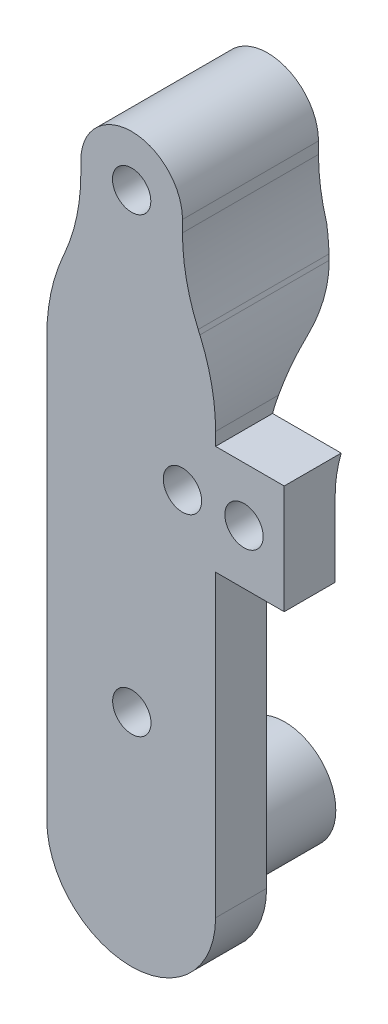
ISO-10303-21;
HEADER;
FILE_DESCRIPTION(('STEP AP214'),'2;1');
FILE_NAME('part.step','',(''),(''),'','','');
FILE_SCHEMA(('AUTOMOTIVE_DESIGN { 1 0 10303 214 1 1 1 1 }'));
ENDSEC;
DATA;
#1=APPLICATION_CONTEXT('core data for automotive mechanical design processes');
#2=APPLICATION_PROTOCOL_DEFINITION('international standard','automotive_design',2000,#1);
#3=PRODUCT_CONTEXT('',#1,'mechanical');
#4=PRODUCT('Part','Part','',(#3));
#5=PRODUCT_RELATED_PRODUCT_CATEGORY('part','',(#4));
#6=PRODUCT_DEFINITION_FORMATION('','',#4);
#7=PRODUCT_DEFINITION_CONTEXT('part definition',#1,'design');
#8=PRODUCT_DEFINITION('design','',#6,#7);
#9=PRODUCT_DEFINITION_SHAPE('','',#8);
#10=(LENGTH_UNIT() NAMED_UNIT(*) SI_UNIT(.MILLI.,.METRE.));
#11=(NAMED_UNIT(*) PLANE_ANGLE_UNIT() SI_UNIT($,.RADIAN.));
#12=(NAMED_UNIT(*) SI_UNIT($,.STERADIAN.) SOLID_ANGLE_UNIT());
#13=UNCERTAINTY_MEASURE_WITH_UNIT(LENGTH_MEASURE(1.E-05),#10,'distance_accuracy_value','');
#14=(GEOMETRIC_REPRESENTATION_CONTEXT(3) GLOBAL_UNCERTAINTY_ASSIGNED_CONTEXT((#13)) GLOBAL_UNIT_ASSIGNED_CONTEXT((#10,
#11,#12)) REPRESENTATION_CONTEXT('',''));
#15=CARTESIAN_POINT('',(0.,0.,0.));
#16=DIRECTION('',(0.,0.,1.));
#17=DIRECTION('',(1.,0.,0.));
#18=AXIS2_PLACEMENT_3D('',#15,#16,#17);
#19=CARTESIAN_POINT('',(3.60162761026961,0.,7.9375));
#20=DIRECTION('',(0.,0.,1.));
#21=DIRECTION('',(1.,0.,0.));
#22=AXIS2_PLACEMENT_3D('',#19,#20,#21);
#23=PLANE('',#22);
#24=DIRECTION('',(0.,1.,0.));
#25=VECTOR('',#24,1.);
#26=CARTESIAN_POINT('',(-18.5661840727653,0.,7.9375));
#27=LINE('',#26,#25);
#28=CARTESIAN_POINT('',(-18.5661840727653,-26.5932502254068,7.9375));
#29=VERTEX_POINT('',#28);
#30=CARTESIAN_POINT('',(-18.5661840727653,8.45332411273592,7.9375));
#31=VERTEX_POINT('',#30);
#32=EDGE_CURVE('E373',#29,#31,#27,.T.);
#33=ORIENTED_EDGE('',*,*,#32,.T.);
#34=DIRECTION('',(-1.,0.,0.));
#35=VECTOR('',#34,1.);
#36=CARTESIAN_POINT('',(3.60162761026961,8.45332411273592,7.9375));
#37=LINE('',#36,#35);
#38=CARTESIAN_POINT('',(3.60162761026961,8.45332411273592,7.9375));
#39=VERTEX_POINT('',#38);
#40=EDGE_CURVE('E262',#39,#31,#37,.T.);
#41=ORIENTED_EDGE('',*,*,#40,.F.);
#42=DIRECTION('',(0.,1.,0.));
#43=VECTOR('',#42,1.);
#44=CARTESIAN_POINT('',(3.60162761026961,0.,7.9375));
#45=LINE('',#44,#43);
#46=CARTESIAN_POINT('',(3.60162761026961,1.35944977459315,7.9375));
#47=VERTEX_POINT('',#46);
#48=EDGE_CURVE('E379',#47,#39,#45,.T.);
#49=ORIENTED_EDGE('',*,*,#48,.F.);
#50=DIRECTION('',(-1.,0.,0.));
#51=VECTOR('',#50,1.);
#52=CARTESIAN_POINT('',(0.,1.35944977459315,7.9375));
#53=LINE('',#52,#51);
#54=CARTESIAN_POINT('',(-2.80556070669548,1.35944977459315,7.9375));
#55=VERTEX_POINT('',#54);
#56=EDGE_CURVE('E663',#47,#55,#53,.T.);
#57=ORIENTED_EDGE('',*,*,#56,.T.);
#58=DIRECTION('',(0.,1.,0.));
#59=VECTOR('',#58,1.);
#60=CARTESIAN_POINT('',(-2.80556070669548,0.,7.9375));
#61=LINE('',#60,#59);
#62=CARTESIAN_POINT('',(-2.80556070669548,-26.5932502254068,7.9375));
#63=VERTEX_POINT('',#62);
#64=EDGE_CURVE('E668',#63,#55,#61,.T.);
#65=ORIENTED_EDGE('',*,*,#64,.F.);
#66=CARTESIAN_POINT('',(-10.6858723897304,-26.5932502254068,7.9375));
#67=DIRECTION('',(0.,0.,1.));
#68=DIRECTION('',(1.,0.,0.));
#69=AXIS2_PLACEMENT_3D('',#66,#67,#68);
#70=CIRCLE('',#69,7.88031168303493);
#71=EDGE_CURVE('E679',#29,#63,#70,.T.);
#72=ORIENTED_EDGE('',*,*,#71,.F.);
#73=EDGE_LOOP('',(#33,#41,#49,#57,#65,#72));
#74=FACE_BOUND('',#73,.T.);
#75=CARTESIAN_POINT('',(-10.6286840727653,-13.8686828818217,7.9375));
#76=DIRECTION('',(0.,0.,1.));
#77=DIRECTION('',(1.,0.,0.));
#78=AXIS2_PLACEMENT_3D('',#75,#76,#77);
#79=CIRCLE('',#78,1.7907);
#80=CARTESIAN_POINT('',(-8.83798407276534,-13.8686828818217,7.9375));
#81=VERTEX_POINT('',#80);
#82=EDGE_CURVE('E689',#81,#81,#79,.T.);
#83=ORIENTED_EDGE('',*,*,#82,.T.);
#84=EDGE_LOOP('',(#83));
#85=FACE_BOUND('',#84,.T.);
#86=CARTESIAN_POINT('',(-0.151184072765344,6.45131711817826,7.9375));
#87=DIRECTION('',(0.,0.,1.));
#88=DIRECTION('',(1.,0.,0.));
#89=AXIS2_PLACEMENT_3D('',#86,#87,#88);
#90=CIRCLE('',#89,1.7907);
#91=CARTESIAN_POINT('',(1.63951592723466,6.45131711817826,7.9375));
#92=VERTEX_POINT('',#91);
#93=EDGE_CURVE('E687',#92,#92,#90,.T.);
#94=ORIENTED_EDGE('',*,*,#93,.T.);
#95=EDGE_LOOP('',(#94));
#96=FACE_BOUND('',#95,.T.);
#97=CARTESIAN_POINT('',(-5.8979723897304,6.45131711817826,7.9375));
#98=DIRECTION('',(0.,0.,1.));
#99=DIRECTION('',(1.,0.,0.));
#100=AXIS2_PLACEMENT_3D('',#97,#98,#99);
#101=CIRCLE('',#100,1.7907);
#102=CARTESIAN_POINT('',(-4.1072723897304,6.45131711817826,7.9375));
#103=VERTEX_POINT('',#102);
#104=EDGE_CURVE('E684',#103,#103,#101,.T.);
#105=ORIENTED_EDGE('',*,*,#104,.T.);
#106=EDGE_LOOP('',(#105));
#107=FACE_BOUND('',#106,.T.);
#108=CARTESIAN_POINT('',(-10.6286840727653,-26.5686828818217,7.9375));
#109=DIRECTION('',(0.,0.,1.));
#110=DIRECTION('',(1.,0.,0.));
#111=AXIS2_PLACEMENT_3D('',#108,#109,#110);
#112=CIRCLE('',#111,4.7625);
#113=CARTESIAN_POINT('',(-5.86618407276534,-26.5686828818217,7.9375));
#114=VERTEX_POINT('',#113);
#115=EDGE_CURVE('E11',#114,#114,#112,.F.);
#116=ORIENTED_EDGE('',*,*,#115,.F.);
#117=EDGE_LOOP('',(#116));
#118=FACE_BOUND('',#117,.T.);
#119=ADVANCED_FACE('F35',(#74,#85,#96,#107,#118),#23,.F.);
#120=CARTESIAN_POINT('',(-20.5855607066955,12.7380281849792,12.7));
#121=DIRECTION('',(0.,0.,-1.));
#122=DIRECTION('',(-1.,0.,0.));
#123=AXIS2_PLACEMENT_3D('',#120,#121,#122);
#124=CYLINDRICAL_SURFACE('',#123,17.78);
#125=CARTESIAN_POINT('',(-4.27280925948273,19.8106896516026,0.622732267532294));
#126=CARTESIAN_POINT('',(-4.22896199061409,19.7095613246999,0.665736288642379));
#127=CARTESIAN_POINT('',(-4.18638890693539,19.6087878170611,0.710838318348563));
#128=CARTESIAN_POINT('',(-4.10377407843014,19.4081759395716,0.805251126791299));
#129=CARTESIAN_POINT('',(-4.06373239764373,19.3083375934334,0.854562011930563));
#130=CARTESIAN_POINT('',(-3.94738066271942,19.0105674357862,1.00882558695881));
#131=CARTESIAN_POINT('',(-3.87484558534822,18.8143843753311,1.12010755892589));
#132=CARTESIAN_POINT('',(-3.74122459889184,18.4333396128202,1.35641056152912));
#133=CARTESIAN_POINT('',(-3.67991088730036,18.2483205172011,1.48105008309362));
#134=CARTESIAN_POINT('',(-3.56628540859261,17.8866783797788,1.74549461429801));
#135=CARTESIAN_POINT('',(-3.51397044655756,17.7100523742767,1.88529421263822));
#136=CARTESIAN_POINT('',(-3.40135283330873,17.3084114181016,2.22943870080631));
#137=CARTESIAN_POINT('',(-3.34437991138073,17.0873568215305,2.43957044129633));
#138=CARTESIAN_POINT('',(-3.26853327587871,16.7705279173371,2.77411382781132));
#139=CARTESIAN_POINT('',(-3.24470269788698,16.6666089036127,2.88985564601395));
#140=CARTESIAN_POINT('',(-3.20021239885874,16.4647851367965,3.127077549516));
#141=CARTESIAN_POINT('',(-3.17955307362549,16.3668811353499,3.24855834862575));
#142=CARTESIAN_POINT('',(-3.16034199645584,16.2721692263519,3.37274488847736));
#143=B_SPLINE_CURVE_WITH_KNOTS('',3,(#125,#126,#127,#128,#129,#130,#131,#132,#133,#134,#135,
#136,#137,#138,#139,#140,#141,#142),.UNSPECIFIED.,.F.,.F.,(4,2,2,2,2,2,2,2,4),(0.,
0.35489761851844,0.709804211747671,1.41963091952058,2.11288210095623,2.80588663996147,
3.73446081441781,4.20633928794254,4.67827660869848),.UNSPECIFIED.);
#144=CARTESIAN_POINT('',(-4.27280925948273,19.8106896516026,0.622732267532297));
#145=VERTEX_POINT('',#144);
#146=CARTESIAN_POINT('',(-3.16034199645584,16.2721692263519,3.37274488847736));
#147=VERTEX_POINT('',#146);
#148=EDGE_CURVE('E252',#145,#147,#143,.T.);
#149=ORIENTED_EDGE('',*,*,#148,.F.);
#150=DIRECTION('',(0.,0.,-1.));
#151=VECTOR('',#150,1.);
#152=CARTESIAN_POINT('',(-4.27280925948273,19.8106896516026,12.7));
#153=LINE('',#152,#151);
#154=CARTESIAN_POINT('',(-4.27280925948273,19.8106896516026,12.7));
#155=VERTEX_POINT('',#154);
#156=EDGE_CURVE('E208',#155,#145,#153,.T.);
#157=ORIENTED_EDGE('',*,*,#156,.F.);
#158=CARTESIAN_POINT('',(-20.5855607066955,12.7380281849792,12.7));
#159=DIRECTION('',(0.,0.,1.));
#160=DIRECTION('',(1.,0.,0.));
#161=AXIS2_PLACEMENT_3D('',#158,#159,#160);
#162=CIRCLE('',#161,17.78);
#163=CARTESIAN_POINT('',(-2.80556070669547,12.7380281849792,12.7));
#164=VERTEX_POINT('',#163);
#165=EDGE_CURVE('E624',#164,#155,#162,.T.);
#166=ORIENTED_EDGE('',*,*,#165,.F.);
#167=DIRECTION('',(0.,0.,-1.));
#168=VECTOR('',#167,1.);
#169=CARTESIAN_POINT('',(-2.80556070669547,12.7380281849792,12.7));
#170=LINE('',#169,#168);
#171=CARTESIAN_POINT('',(-2.80556070669547,12.7380281849792,6.81854866633524));
#172=VERTEX_POINT('',#171);
#173=EDGE_CURVE('E211',#164,#172,#170,.T.);
#174=ORIENTED_EDGE('',*,*,#173,.T.);
#175=CARTESIAN_POINT('',(-2.80556070669547,12.7380281849792,6.81854866633524));
#176=CARTESIAN_POINT('',(-2.80553996273045,12.9499645172494,6.69979018167025));
#177=CARTESIAN_POINT('',(-2.80934955256784,13.1568967579065,6.57218157788998));
#178=CARTESIAN_POINT('',(-2.82340534440474,13.5593633567003,6.30032318239146));
#179=CARTESIAN_POINT('',(-2.83365285745637,13.7548953843729,6.15607000597178));
#180=CARTESIAN_POINT('',(-2.8591415350942,14.1298784304107,5.85460813032012));
#181=CARTESIAN_POINT('',(-2.87429509162777,14.3095458831307,5.69766054341327));
#182=CARTESIAN_POINT('',(-2.90837551794025,14.6552279798961,5.3699196508939));
#183=CARTESIAN_POINT('',(-2.92730025158917,14.8212502781906,5.19913421588552));
#184=CARTESIAN_POINT('',(-2.95724302957186,15.0568272640496,4.93620124418279));
#185=CARTESIAN_POINT('',(-2.9673071850757,15.1319875390125,4.84890651205389));
#186=CARTESIAN_POINT('',(-2.98792087721756,15.2790921888179,4.67108296937014));
#187=CARTESIAN_POINT('',(-2.99847226723567,15.3510218047874,4.58054216354444));
#188=CARTESIAN_POINT('',(-3.00917448930018,15.4211322710998,4.48861502211213));
#189=B_SPLINE_CURVE_WITH_KNOTS('',3,(#175,#176,#177,#178,#179,#180,#181,#182,#183,#184,#185,
#186,#187,#188),.UNSPECIFIED.,.F.,.F.,(4,2,2,2,2,2,4),(0.,0.728531239658855,1.45721088931712,
2.17353648255022,2.88945747076875,3.23627654611799,3.58454561209276),.UNSPECIFIED.);
#190=CARTESIAN_POINT('',(-3.00917448930018,15.4211322710998,4.48861502211213));
#191=VERTEX_POINT('',#190);
#192=EDGE_CURVE('E319',#172,#191,#189,.T.);
#193=ORIENTED_EDGE('',*,*,#192,.T.);
#194=CARTESIAN_POINT('',(-20.5855607066955,12.7380281849792,8.00667107908841));
#195=DIRECTION('',(0.,0.795139582148108,0.60642645465162));
#196=DIRECTION('',(0.,0.60642645465162,-0.795139582148108));
#197=AXIS2_PLACEMENT_3D('',#194,#195,#196);
#198=ELLIPSE('',#197,29.3193013985748,17.78);
#199=EDGE_CURVE('E181',#191,#147,#198,.T.);
#200=ORIENTED_EDGE('',*,*,#199,.T.);
#201=EDGE_LOOP('',(#149,#157,#166,#174,#193,#200));
#202=FACE_BOUND('',#201,.T.);
#203=ADVANCED_FACE('F305',(#202),#124,.T.);
#204=CARTESIAN_POINT('',(3.63342929666762,1.57533298177198,12.7));
#205=DIRECTION('',(-0.917477584207683,-0.397787484062073,0.));
#206=DIRECTION('',(0.397787484062073,-0.917477584207683,0.));
#207=AXIS2_PLACEMENT_3D('',#204,#205,#206);
#208=PLANE('',#207);
#209=CARTESIAN_POINT('',(-5.75963331160175,23.2399773847158,8.68685991058949));
#210=DIRECTION('',(-0.917477584207683,-0.397787484062073,0.));
#211=DIRECTION('',(-0.397787484062073,0.917477584207683,0.));
#212=AXIS2_PLACEMENT_3D('',#209,#210,#211);
#213=ELLIPSE('',#212,9.55118702716597,8.76299999999999);
#214=CARTESIAN_POINT('',(-4.43072383694313,20.1749119834871,0.477381054645554));
#215=VERTEX_POINT('',#214);
#216=EDGE_CURVE('E292',#215,#145,#213,.T.);
#217=ORIENTED_EDGE('',*,*,#216,.F.);
#218=DIRECTION('',(0.,0.,-1.));
#219=VECTOR('',#218,1.);
#220=CARTESIAN_POINT('',(-4.43072383694314,20.1749119834871,12.7));
#221=LINE('',#220,#219);
#222=CARTESIAN_POINT('',(-4.43072383694314,20.1749119834871,12.7));
#223=VERTEX_POINT('',#222);
#224=EDGE_CURVE('E205',#223,#215,#221,.T.);
#225=ORIENTED_EDGE('',*,*,#224,.F.);
#226=DIRECTION('',(-0.397787484062073,0.917477584207683,0.));
#227=VECTOR('',#226,1.);
#228=CARTESIAN_POINT('',(3.63342929666762,1.57533298177198,12.7));
#229=LINE('',#228,#227);
#230=EDGE_CURVE('E622',#155,#223,#229,.T.);
#231=ORIENTED_EDGE('',*,*,#230,.F.);
#232=ORIENTED_EDGE('',*,*,#156,.T.);
#233=EDGE_LOOP('',(#217,#225,#231,#232));
#234=FACE_BOUND('',#233,.T.);
#235=ADVANCED_FACE('F299',(#234),#208,.F.);
#236=CARTESIAN_POINT('',(11.8820276102696,27.2475734501104,12.7));
#237=DIRECTION('',(0.,0.,-1.));
#238=DIRECTION('',(-1.,0.,0.));
#239=AXIS2_PLACEMENT_3D('',#236,#237,#238);
#240=CYLINDRICAL_SURFACE('',#239,17.78);
#241=ORIENTED_EDGE('',*,*,#224,.T.);
#242=CARTESIAN_POINT('',(-4.43072383694313,20.1749119834871,0.477381054645554));
#243=CARTESIAN_POINT('',(-4.49659893518475,20.3268330196942,0.420657521074083));
#244=CARTESIAN_POINT('',(-4.56088989065264,20.4809492455378,0.367925294425049));
#245=CARTESIAN_POINT('',(-4.68572899031803,20.7926623395471,0.270960585733989));
#246=CARTESIAN_POINT('',(-4.74628898176269,20.9502457766355,0.226700146714175));
#247=CARTESIAN_POINT('',(-4.86354172418653,21.269016708808,0.146808579875556));
#248=CARTESIAN_POINT('',(-4.92023429818063,21.430204368385,0.111177846788976));
#249=CARTESIAN_POINT('',(-5.02961038897305,21.7562488008639,0.0487822539979684));
#250=CARTESIAN_POINT('',(-5.08227974923076,21.9211161093595,0.0220476814330709));
#251=CARTESIAN_POINT('',(-5.13267538044139,22.0873135595729,0.));
#252=B_SPLINE_CURVE_WITH_KNOTS('',3,(#242,#243,#244,#245,#246,#247,#248,#249,#250,#251),
.UNSPECIFIED.,.F.,.F.,(4,2,2,2,4),(0.,0.525060076447199,1.04835639184211,1.57167663886644,
2.09676073325123),.UNSPECIFIED.);
#253=CARTESIAN_POINT('',(-5.13267538044139,22.0873135595729,0.));
#254=VERTEX_POINT('',#253);
#255=EDGE_CURVE('E285',#215,#254,#252,.T.);
#256=ORIENTED_EDGE('',*,*,#255,.T.);
#257=CARTESIAN_POINT('',(11.8820276102696,27.2475734501104,0.));
#258=DIRECTION('',(0.,0.,1.));
#259=DIRECTION('',(1.,0.,0.));
#260=AXIS2_PLACEMENT_3D('',#257,#258,#259);
#261=CIRCLE('',#260,17.78);
#262=CARTESIAN_POINT('',(-5.89797238973039,27.2475734501104,0.));
#263=VERTEX_POINT('',#262);
#264=EDGE_CURVE('E177',#263,#254,#261,.T.);
#265=ORIENTED_EDGE('',*,*,#264,.F.);
#266=DIRECTION('',(0.,0.,-1.));
#267=VECTOR('',#266,1.);
#268=CARTESIAN_POINT('',(-5.89797238973039,27.2475734501104,12.7));
#269=LINE('',#268,#267);
#270=CARTESIAN_POINT('',(-5.89797238973039,27.2475734501104,12.7));
#271=VERTEX_POINT('',#270);
#272=EDGE_CURVE('E203',#271,#263,#269,.T.);
#273=ORIENTED_EDGE('',*,*,#272,.F.);
#274=CARTESIAN_POINT('',(11.8820276102696,27.2475734501104,12.7));
#275=DIRECTION('',(0.,0.,1.));
#276=DIRECTION('',(1.,0.,0.));
#277=AXIS2_PLACEMENT_3D('',#274,#275,#276);
#278=CIRCLE('',#277,17.78);
#279=EDGE_CURVE('E619',#271,#223,#278,.T.);
#280=ORIENTED_EDGE('',*,*,#279,.T.);
#281=EDGE_LOOP('',(#241,#256,#265,#273,#280));
#282=FACE_BOUND('',#281,.T.);
#283=ADVANCED_FACE('F293',(#282),#240,.F.);
#284=CARTESIAN_POINT('',(-33.1711840727653,27.2867056998739,12.7));
#285=DIRECTION('',(0.,0.,-1.));
#286=DIRECTION('',(-1.,0.,0.));
#287=AXIS2_PLACEMENT_3D('',#284,#285,#286);
#288=CYLINDRICAL_SURFACE('',#287,17.78);
#289=CARTESIAN_POINT('',(-16.8792929836201,20.1661239301425,0.480667496332566));
#290=CARTESIAN_POINT('',(-16.8126098192679,20.318678174608,0.423521380595959));
#291=CARTESIAN_POINT('',(-16.7475219688787,20.473455619094,0.37039934873752));
#292=CARTESIAN_POINT('',(-16.6211218748251,20.786537496415,0.272729427097992));
#293=CARTESIAN_POINT('',(-16.5597975956829,20.9448282157668,0.228153120460066));
#294=CARTESIAN_POINT('',(-16.4410504139583,21.2650628508689,0.147707071534118));
#295=CARTESIAN_POINT('',(-16.3836276931759,21.4270069363864,0.111837734762239));
#296=CARTESIAN_POINT('',(-16.2728275187645,21.7546148435826,0.0490474562736576));
#297=CARTESIAN_POINT('',(-16.219464468493,21.920289431813,0.0221573239951851));
#298=CARTESIAN_POINT('',(-16.1683983783158,22.0873135595729,0.));
#299=B_SPLINE_CURVE_WITH_KNOTS('',3,(#289,#290,#291,#292,#293,#294,#295,#296,#297,#298),
.UNSPECIFIED.,.F.,.F.,(4,2,2,2,4),(0.,0.528033887393433,1.05428024701051,1.58055111118782,
2.1086095928006),.UNSPECIFIED.);
#300=CARTESIAN_POINT('',(-16.8792929836201,20.1661239301425,0.480667496332569));
#301=VERTEX_POINT('',#300);
#302=CARTESIAN_POINT('',(-16.1683983783158,22.0873135595729,0.));
#303=VERTEX_POINT('',#302);
#304=EDGE_CURVE('E50',#301,#303,#299,.T.);
#305=ORIENTED_EDGE('',*,*,#304,.F.);
#306=DIRECTION('',(0.,0.,-1.));
#307=VECTOR('',#306,1.);
#308=CARTESIAN_POINT('',(-16.8792929836201,20.1661239301425,12.7));
#309=LINE('',#308,#307);
#310=CARTESIAN_POINT('',(-16.8792929836201,20.1661239301425,12.7));
#311=VERTEX_POINT('',#310);
#312=EDGE_CURVE('E154',#311,#301,#309,.T.);
#313=ORIENTED_EDGE('',*,*,#312,.F.);
#314=CARTESIAN_POINT('',(-33.1711840727653,27.2867056998739,12.7));
#315=DIRECTION('',(0.,0.,1.));
#316=DIRECTION('',(1.,0.,0.));
#317=AXIS2_PLACEMENT_3D('',#314,#315,#316);
#318=CIRCLE('',#317,17.78);
#319=CARTESIAN_POINT('',(-15.3911840727653,27.2867056998739,12.7));
#320=VERTEX_POINT('',#319);
#321=EDGE_CURVE('E141',#320,#311,#318,.F.);
#322=ORIENTED_EDGE('',*,*,#321,.F.);
#323=DIRECTION('',(0.,0.,-1.));
#324=VECTOR('',#323,1.);
#325=CARTESIAN_POINT('',(-15.3911840727653,27.2867056998739,12.7));
#326=LINE('',#325,#324);
#327=CARTESIAN_POINT('',(-15.3911840727653,27.2867056998739,0.));
#328=VERTEX_POINT('',#327);
#329=EDGE_CURVE('E197',#320,#328,#326,.T.);
#330=ORIENTED_EDGE('',*,*,#329,.T.);
#331=CARTESIAN_POINT('',(-33.1711840727653,27.2867056998739,0.));
#332=DIRECTION('',(0.,0.,1.));
#333=DIRECTION('',(1.,0.,0.));
#334=AXIS2_PLACEMENT_3D('',#331,#332,#333);
#335=CIRCLE('',#334,17.78);
#336=EDGE_CURVE('E187',#328,#303,#335,.F.);
#337=ORIENTED_EDGE('',*,*,#336,.T.);
#338=EDGE_LOOP('',(#305,#313,#322,#330,#337));
#339=FACE_BOUND('',#338,.T.);
#340=ADVANCED_FACE('F298',(#339),#288,.F.);
#341=CARTESIAN_POINT('',(-21.572326083604,9.42846419737935,12.7));
#342=DIRECTION('',(0.916304335722455,-0.400482664214358,0.));
#343=DIRECTION('',(0.400482664214359,0.916304335722455,0.));
#344=AXIS2_PLACEMENT_3D('',#341,#342,#343);
#345=PLANE('',#344);
#346=CARTESIAN_POINT('',(-15.5358255646633,23.2399773847158,8.68685991058949));
#347=DIRECTION('',(0.916304335722455,-0.400482664214358,0.));
#348=DIRECTION('',(-0.400482664214359,-0.916304335722455,0.));
#349=AXIS2_PLACEMENT_3D('',#346,#347,#348);
#350=ELLIPSE('',#349,9.56341649643168,8.76299999999999);
#351=CARTESIAN_POINT('',(-17.0780751619105,19.711310306214,0.66572048722215));
#352=VERTEX_POINT('',#351);
#353=EDGE_CURVE('E151',#352,#301,#350,.T.);
#354=ORIENTED_EDGE('',*,*,#353,.F.);
#355=DIRECTION('',(0.,0.,-1.));
#356=VECTOR('',#355,1.);
#357=CARTESIAN_POINT('',(-17.0780751619105,19.711310306214,12.7));
#358=LINE('',#357,#356);
#359=CARTESIAN_POINT('',(-17.0780751619105,19.711310306214,12.7));
#360=VERTEX_POINT('',#359);
#361=EDGE_CURVE('E148',#360,#352,#358,.T.);
#362=ORIENTED_EDGE('',*,*,#361,.F.);
#363=DIRECTION('',(-0.400482664214359,-0.916304335722455,0.));
#364=VECTOR('',#363,1.);
#365=CARTESIAN_POINT('',(-21.572326083604,9.42846419737935,12.7));
#366=LINE('',#365,#364);
#367=EDGE_CURVE('E133',#311,#360,#366,.T.);
#368=ORIENTED_EDGE('',*,*,#367,.F.);
#369=ORIENTED_EDGE('',*,*,#312,.T.);
#370=EDGE_LOOP('',(#354,#362,#368,#369));
#371=FACE_BOUND('',#370,.T.);
#372=ADVANCED_FACE('F149',(#371),#345,.F.);
#373=CARTESIAN_POINT('',(-0.786184072765341,12.5907285364826,12.7));
#374=DIRECTION('',(0.,0.,-1.));
#375=DIRECTION('',(-1.,0.,0.));
#376=AXIS2_PLACEMENT_3D('',#373,#374,#375);
#377=CYLINDRICAL_SURFACE('',#376,17.78);
#378=ORIENTED_EDGE('',*,*,#361,.T.);
#379=CARTESIAN_POINT('',(-17.0780751619105,19.711310306214,0.66572048722215));
#380=CARTESIAN_POINT('',(-17.1220077633292,19.6107956023752,0.709938174263891));
#381=CARTESIAN_POINT('',(-17.1646642042854,19.5106588975349,0.756246884892099));
#382=CARTESIAN_POINT('',(-17.2474435908244,19.3113663361745,0.853057589493892));
#383=CARTESIAN_POINT('',(-17.2875664610798,19.2122105088915,0.903559708041728));
#384=CARTESIAN_POINT('',(-17.4041625144159,18.9165520544327,1.06137345157627));
#385=CARTESIAN_POINT('',(-17.4768593437691,18.7218671866478,1.17498864219536));
#386=CARTESIAN_POINT('',(-17.6108397208608,18.3438741744831,1.4158597627734));
#387=CARTESIAN_POINT('',(-17.6723458174506,18.1604078097985,1.54274535075208));
#388=CARTESIAN_POINT('',(-17.7863661505249,17.8020187183963,1.81162085744036));
#389=CARTESIAN_POINT('',(-17.838883835513,17.627092733561,1.95360494939145));
#390=CARTESIAN_POINT('',(-17.9177353373873,17.3500155523374,2.19694993640473));
#391=CARTESIAN_POINT('',(-17.94659105927,17.2447796070273,2.29402390195868));
#392=CARTESIAN_POINT('',(-18.0011412746067,17.0387616733312,2.49366501180116));
#393=CARTESIAN_POINT('',(-18.0268354704854,16.9379801047799,2.59623267187577));
#394=CARTESIAN_POINT('',(-18.0756039227785,16.7398162946364,2.80813372359635));
#395=CARTESIAN_POINT('',(-18.098633992373,16.6425060300344,2.91754454242139));
#396=CARTESIAN_POINT('',(-18.1418413929826,16.4532381500859,3.1414246011709));
#397=CARTESIAN_POINT('',(-18.162018980546,16.3612800538108,3.25589338497179));
#398=CARTESIAN_POINT('',(-18.1808785066143,16.2721692263519,3.37274488847736));
#399=B_SPLINE_CURVE_WITH_KNOTS('',3,(#379,#380,#381,#382,#383,#384,#385,#386,#387,#388,#389,
#390,#391,#392,#393,#394,#395,#396,#397,#398),.UNSPECIFIED.,.F.,.F.,(4,2,2,2,2,2,2,2,2,4),(0.,
0.35476477228259,0.70954008739308,1.41912139794631,2.11251402352546,2.80564002209987,
3.24360656759691,3.68161430475022,4.1260765116121,4.57049871867508),.UNSPECIFIED.);
#400=CARTESIAN_POINT('',(-18.1808785066143,16.2721692263519,3.37274488847736));
#401=VERTEX_POINT('',#400);
#402=EDGE_CURVE('E249',#352,#401,#399,.T.);
#403=ORIENTED_EDGE('',*,*,#402,.T.);
#404=CARTESIAN_POINT('',(-0.786184072765341,12.5907285364826,8.19980873008919));
#405=DIRECTION('',(0.,0.795139582148108,0.60642645465162));
#406=DIRECTION('',(0.,0.60642645465162,-0.795139582148108));
#407=AXIS2_PLACEMENT_3D('',#404,#405,#406);
#408=ELLIPSE('',#407,29.3193013985748,17.78);
#409=CARTESIAN_POINT('',(-18.3394519935562,15.4211322710998,4.48861502211213));
#410=VERTEX_POINT('',#409);
#411=EDGE_CURVE('E43',#410,#401,#408,.F.);
#412=ORIENTED_EDGE('',*,*,#411,.F.);
#413=CARTESIAN_POINT('',(-18.5661840727653,12.5907285364826,6.89926884018944));
#414=CARTESIAN_POINT('',(-18.5662063398615,12.8049762035687,6.78455510705702));
#415=CARTESIAN_POINT('',(-18.5623121929099,13.0143853435876,6.6608908401121));
#416=CARTESIAN_POINT('',(-18.5479021318596,13.4220972042836,6.39670983245155));
#417=CARTESIAN_POINT('',(-18.5373853184071,13.6203984125272,6.25619080496862));
#418=CARTESIAN_POINT('',(-18.5111763857094,14.0009971067857,5.96201547968641));
#419=CARTESIAN_POINT('',(-18.4955794669117,14.1835162224902,5.80863672341326));
#420=CARTESIAN_POINT('',(-18.4604228237586,14.5351763135483,5.48780646993579));
#421=CARTESIAN_POINT('',(-18.4408651227239,14.7043240584218,5.32036218340422));
#422=CARTESIAN_POINT('',(-18.4073741554779,14.9638595774293,5.04166388445938));
#423=CARTESIAN_POINT('',(-18.3942954995074,15.0588275670212,4.93453213368267));
#424=CARTESIAN_POINT('',(-18.3673682085765,15.2438674436237,4.71520267173173));
#425=CARTESIAN_POINT('',(-18.3535157655441,15.3339098246206,4.60298053218942));
#426=CARTESIAN_POINT('',(-18.3394519935562,15.4211322710998,4.48861502211213));
#427=B_SPLINE_CURVE_WITH_KNOTS('',3,(#413,#414,#415,#416,#417,#418,#419,#420,#421,#422,#423,
#424,#425,#426),.UNSPECIFIED.,.F.,.F.,(4,2,2,2,2,2,4),(0.,0.728778302871286,1.4576555947191,
2.17359198911399,2.88916357388404,3.3202893908802,3.75376495027548),.UNSPECIFIED.);
#428=CARTESIAN_POINT('',(-18.5661840727653,12.5907285364826,6.89926884018945));
#429=VERTEX_POINT('',#428);
#430=EDGE_CURVE('E327',#429,#410,#427,.T.);
#431=ORIENTED_EDGE('',*,*,#430,.F.);
#432=DIRECTION('',(0.,0.,-1.));
#433=VECTOR('',#432,1.);
#434=CARTESIAN_POINT('',(-18.5661840727653,12.5907285364826,12.7));
#435=LINE('',#434,#433);
#436=CARTESIAN_POINT('',(-18.5661840727653,12.5907285364826,12.7));
#437=VERTEX_POINT('',#436);
#438=EDGE_CURVE('E155',#437,#429,#435,.T.);
#439=ORIENTED_EDGE('',*,*,#438,.F.);
#440=CARTESIAN_POINT('',(-0.786184072765341,12.5907285364826,12.7));
#441=DIRECTION('',(0.,0.,1.));
#442=DIRECTION('',(1.,0.,0.));
#443=AXIS2_PLACEMENT_3D('',#440,#441,#442);
#444=CIRCLE('',#443,17.78);
#445=EDGE_CURVE('E139',#437,#360,#444,.F.);
#446=ORIENTED_EDGE('',*,*,#445,.T.);
#447=EDGE_LOOP('',(#378,#403,#412,#431,#439,#446));
#448=FACE_BOUND('',#447,.T.);
#449=ADVANCED_FACE('F157',(#448),#377,.T.);
#450=CARTESIAN_POINT('',(0.,0.,0.));
#451=DIRECTION('',(0.,0.,1.));
#452=DIRECTION('',(1.,0.,0.));
#453=AXIS2_PLACEMENT_3D('',#450,#451,#452);
#454=PLANE('',#453);
#455=CARTESIAN_POINT('',(-10.6445782312479,28.3342497745932,0.));
#456=DIRECTION('',(0.,0.,1.));
#457=DIRECTION('',(1.,0.,0.));
#458=AXIS2_PLACEMENT_3D('',#455,#456,#457);
#459=CIRCLE('',#458,1.7907);
#460=CARTESIAN_POINT('',(-8.85387823124787,28.3342497745932,0.));
#461=VERTEX_POINT('',#460);
#462=EDGE_CURVE('E190',#461,#461,#459,.T.);
#463=ORIENTED_EDGE('',*,*,#462,.T.);
#464=EDGE_LOOP('',(#463));
#465=FACE_BOUND('',#464,.T.);
#466=DIRECTION('',(-1.,0.,0.));
#467=VECTOR('',#466,1.);
#468=CARTESIAN_POINT('',(3.60162761026961,22.0873135595729,0.));
#469=LINE('',#468,#467);
#470=EDGE_CURVE('E228',#303,#254,#469,.F.);
#471=ORIENTED_EDGE('',*,*,#470,.F.);
#472=ORIENTED_EDGE('',*,*,#336,.F.);
#473=DIRECTION('',(0.,-1.,0.));
#474=VECTOR('',#473,1.);
#475=CARTESIAN_POINT('',(-15.3911840727653,0.,0.));
#476=LINE('',#475,#474);
#477=CARTESIAN_POINT('',(-15.3911840727653,28.3342497745932,0.));
#478=VERTEX_POINT('',#477);
#479=EDGE_CURVE('E82',#478,#328,#476,.T.);
#480=ORIENTED_EDGE('',*,*,#479,.F.);
#481=CARTESIAN_POINT('',(-10.6445782312479,28.3342497745932,0.));
#482=DIRECTION('',(0.,0.,1.));
#483=DIRECTION('',(1.,0.,0.));
#484=AXIS2_PLACEMENT_3D('',#481,#482,#483);
#485=CIRCLE('',#484,4.74660584151747);
#486=CARTESIAN_POINT('',(-5.8979723897304,28.3342497745932,0.));
#487=VERTEX_POINT('',#486);
#488=EDGE_CURVE('E184',#487,#478,#485,.T.);
#489=ORIENTED_EDGE('',*,*,#488,.F.);
#490=DIRECTION('',(0.,-1.,0.));
#491=VECTOR('',#490,1.);
#492=CARTESIAN_POINT('',(-5.89797238973035,0.,0.));
#493=LINE('',#492,#491);
#494=EDGE_CURVE('E180',#487,#263,#493,.T.);
#495=ORIENTED_EDGE('',*,*,#494,.T.);
#496=ORIENTED_EDGE('',*,*,#264,.T.);
#497=EDGE_LOOP('',(#471,#472,#480,#489,#495,#496));
#498=FACE_BOUND('',#497,.T.);
#499=ADVANCED_FACE('F344',(#465,#498),#454,.F.);
#500=CARTESIAN_POINT('',(-10.6858723897304,-26.5932502254068,12.7));
#501=DIRECTION('',(0.,0.,-1.));
#502=DIRECTION('',(-1.,0.,0.));
#503=AXIS2_PLACEMENT_3D('',#500,#501,#502);
#504=CYLINDRICAL_SURFACE('',#503,7.88031168303493);
#505=DIRECTION('',(0.,0.,-1.));
#506=VECTOR('',#505,1.);
#507=CARTESIAN_POINT('',(-18.5661840727653,-26.5932502254068,12.7));
#508=LINE('',#507,#506);
#509=CARTESIAN_POINT('',(-18.5661840727653,-26.5932502254068,12.7));
#510=VERTEX_POINT('',#509);
#511=EDGE_CURVE('E59',#510,#29,#508,.T.);
#512=ORIENTED_EDGE('',*,*,#511,.T.);
#513=ORIENTED_EDGE('',*,*,#71,.T.);
#514=DIRECTION('',(0.,0.,-1.));
#515=VECTOR('',#514,1.);
#516=CARTESIAN_POINT('',(-2.80556070669548,-26.5932502254068,12.7));
#517=LINE('',#516,#515);
#518=CARTESIAN_POINT('',(-2.80556070669548,-26.5932502254068,12.7));
#519=VERTEX_POINT('',#518);
#520=EDGE_CURVE('E226',#519,#63,#517,.T.);
#521=ORIENTED_EDGE('',*,*,#520,.F.);
#522=CARTESIAN_POINT('',(-10.6858723897304,-26.5932502254068,12.7));
#523=DIRECTION('',(0.,0.,1.));
#524=DIRECTION('',(1.,0.,0.));
#525=AXIS2_PLACEMENT_3D('',#522,#523,#524);
#526=CIRCLE('',#525,7.88031168303493);
#527=EDGE_CURVE('E193',#510,#519,#526,.T.);
#528=ORIENTED_EDGE('',*,*,#527,.F.);
#529=EDGE_LOOP('',(#512,#513,#521,#528));
#530=FACE_BOUND('',#529,.T.);
#531=ADVANCED_FACE('F37',(#530),#504,.T.);
#532=CARTESIAN_POINT('',(-2.80556070669548,0.,12.7));
#533=DIRECTION('',(-1.,0.,0.));
#534=DIRECTION('',(0.,-1.,0.));
#535=AXIS2_PLACEMENT_3D('',#532,#533,#534);
#536=PLANE('',#535);
#537=ORIENTED_EDGE('',*,*,#520,.T.);
#538=ORIENTED_EDGE('',*,*,#64,.T.);
#539=DIRECTION('',(0.,0.,-1.));
#540=VECTOR('',#539,1.);
#541=CARTESIAN_POINT('',(-2.80556070669548,1.35944977459315,12.7));
#542=LINE('',#541,#540);
#543=CARTESIAN_POINT('',(-2.80556070669548,1.35944977459315,12.7));
#544=VERTEX_POINT('',#543);
#545=EDGE_CURVE('E223',#544,#55,#542,.T.);
#546=ORIENTED_EDGE('',*,*,#545,.F.);
#547=DIRECTION('',(0.,1.,0.));
#548=VECTOR('',#547,1.);
#549=CARTESIAN_POINT('',(-2.80556070669548,0.,12.7));
#550=LINE('',#549,#548);
#551=EDGE_CURVE('E91',#519,#544,#550,.T.);
#552=ORIENTED_EDGE('',*,*,#551,.F.);
#553=EDGE_LOOP('',(#537,#538,#546,#552));
#554=FACE_BOUND('',#553,.T.);
#555=ADVANCED_FACE('F502',(#554),#536,.F.);
#556=CARTESIAN_POINT('',(0.,1.35944977459315,12.7));
#557=DIRECTION('',(0.,-1.,0.));
#558=DIRECTION('',(1.,0.,0.));
#559=AXIS2_PLACEMENT_3D('',#556,#557,#558);
#560=PLANE('',#559);
#561=ORIENTED_EDGE('',*,*,#56,.F.);
#562=DIRECTION('',(0.,0.,-1.));
#563=VECTOR('',#562,1.);
#564=CARTESIAN_POINT('',(3.6016276102696,1.35944977459315,12.7));
#565=LINE('',#564,#563);
#566=CARTESIAN_POINT('',(3.6016276102696,1.35944977459315,12.7));
#567=VERTEX_POINT('',#566);
#568=EDGE_CURVE('E220',#567,#47,#565,.T.);
#569=ORIENTED_EDGE('',*,*,#568,.F.);
#570=DIRECTION('',(-1.,0.,0.));
#571=VECTOR('',#570,1.);
#572=CARTESIAN_POINT('',(0.,1.35944977459315,12.7));
#573=LINE('',#572,#571);
#574=EDGE_CURVE('E633',#567,#544,#573,.T.);
#575=ORIENTED_EDGE('',*,*,#574,.T.);
#576=ORIENTED_EDGE('',*,*,#545,.T.);
#577=EDGE_LOOP('',(#561,#569,#575,#576));
#578=FACE_BOUND('',#577,.T.);
#579=ADVANCED_FACE('F493',(#578),#560,.T.);
#580=CARTESIAN_POINT('',(3.6016276102696,0.,12.7));
#581=DIRECTION('',(1.,0.,0.));
#582=DIRECTION('',(0.,1.,0.));
#583=AXIS2_PLACEMENT_3D('',#580,#581,#582);
#584=PLANE('',#583);
#585=CARTESIAN_POINT('',(3.60162761026961,8.45332411273592,-0.825499999999998));
#586=DIRECTION('',(-1.,0.,0.));
#587=DIRECTION('',(0.,0.,1.));
#588=AXIS2_PLACEMENT_3D('',#585,#586,#587);
#589=CIRCLE('',#588,8.763);
#590=CARTESIAN_POINT('',(3.60162761026961,11.5313171181783,7.37914064163983));
#591=VERTEX_POINT('',#590);
#592=EDGE_CURVE('E382',#39,#591,#589,.T.);
#593=ORIENTED_EDGE('',*,*,#592,.T.);
#594=DIRECTION('',(0.,0.,-1.));
#595=VECTOR('',#594,1.);
#596=CARTESIAN_POINT('',(3.6016276102696,11.5313171181783,12.7));
#597=LINE('',#596,#595);
#598=CARTESIAN_POINT('',(3.6016276102696,11.5313171181783,12.7));
#599=VERTEX_POINT('',#598);
#600=EDGE_CURVE('E217',#599,#591,#597,.T.);
#601=ORIENTED_EDGE('',*,*,#600,.F.);
#602=DIRECTION('',(0.,-1.,0.));
#603=VECTOR('',#602,1.);
#604=CARTESIAN_POINT('',(3.6016276102696,0.,12.7));
#605=LINE('',#604,#603);
#606=EDGE_CURVE('E630',#599,#567,#605,.T.);
#607=ORIENTED_EDGE('',*,*,#606,.T.);
#608=ORIENTED_EDGE('',*,*,#568,.T.);
#609=ORIENTED_EDGE('',*,*,#48,.T.);
#610=EDGE_LOOP('',(#593,#601,#607,#608,#609));
#611=FACE_BOUND('',#610,.T.);
#612=ADVANCED_FACE('F484',(#611),#584,.T.);
#613=CARTESIAN_POINT('',(0.,11.5313171181783,12.7));
#614=DIRECTION('',(0.,-1.,0.));
#615=DIRECTION('',(0.,0.,-1.));
#616=AXIS2_PLACEMENT_3D('',#613,#614,#615);
#617=PLANE('',#616);
#618=ORIENTED_EDGE('',*,*,#600,.T.);
#619=DIRECTION('',(-1.,0.,0.));
#620=VECTOR('',#619,1.);
#621=CARTESIAN_POINT('',(3.60162761026961,11.5313171181783,7.37914064163983));
#622=LINE('',#621,#620);
#623=CARTESIAN_POINT('',(-2.80556070669548,11.5313171181783,7.37914064163983));
#624=VERTEX_POINT('',#623);
#625=EDGE_CURVE('E638',#591,#624,#622,.T.);
#626=ORIENTED_EDGE('',*,*,#625,.T.);
#627=DIRECTION('',(0.,0.,-1.));
#628=VECTOR('',#627,1.);
#629=CARTESIAN_POINT('',(-2.80556070669548,11.5313171181783,12.7));
#630=LINE('',#629,#628);
#631=CARTESIAN_POINT('',(-2.80556070669548,11.5313171181783,12.7));
#632=VERTEX_POINT('',#631);
#633=EDGE_CURVE('E214',#632,#624,#630,.T.);
#634=ORIENTED_EDGE('',*,*,#633,.F.);
#635=DIRECTION('',(-1.,0.,0.));
#636=VECTOR('',#635,1.);
#637=CARTESIAN_POINT('',(0.,11.5313171181783,12.7));
#638=LINE('',#637,#636);
#639=EDGE_CURVE('E628',#599,#632,#638,.T.);
#640=ORIENTED_EDGE('',*,*,#639,.F.);
#641=EDGE_LOOP('',(#618,#626,#634,#640));
#642=FACE_BOUND('',#641,.T.);
#643=ADVANCED_FACE('F473',(#642),#617,.F.);
#644=CARTESIAN_POINT('',(-2.80556070669549,0.,12.7));
#645=DIRECTION('',(-1.,0.,0.));
#646=DIRECTION('',(0.,-1.,0.));
#647=AXIS2_PLACEMENT_3D('',#644,#645,#646);
#648=PLANE('',#647);
#649=ORIENTED_EDGE('',*,*,#633,.T.);
#650=CARTESIAN_POINT('',(-2.80556070669548,8.45332411273592,-0.825499999999998));
#651=DIRECTION('',(-1.,0.,0.));
#652=DIRECTION('',(0.,-1.,0.));
#653=AXIS2_PLACEMENT_3D('',#650,#651,#652);
#654=CIRCLE('',#653,8.763);
#655=EDGE_CURVE('E326',#624,#172,#654,.T.);
#656=ORIENTED_EDGE('',*,*,#655,.T.);
#657=ORIENTED_EDGE('',*,*,#173,.F.);
#658=DIRECTION('',(0.,1.,0.));
#659=VECTOR('',#658,1.);
#660=CARTESIAN_POINT('',(-2.80556070669549,0.,12.7));
#661=LINE('',#660,#659);
#662=EDGE_CURVE('E626',#632,#164,#661,.T.);
#663=ORIENTED_EDGE('',*,*,#662,.F.);
#664=EDGE_LOOP('',(#649,#656,#657,#663));
#665=FACE_BOUND('',#664,.T.);
#666=ADVANCED_FACE('F311',(#665),#648,.F.);
#667=CARTESIAN_POINT('',(-5.89797238973035,0.,12.7));
#668=DIRECTION('',(1.,0.,0.));
#669=DIRECTION('',(0.,1.,0.));
#670=AXIS2_PLACEMENT_3D('',#667,#668,#669);
#671=PLANE('',#670);
#672=ORIENTED_EDGE('',*,*,#494,.F.);
#673=DIRECTION('',(0.,0.,-1.));
#674=VECTOR('',#673,1.);
#675=CARTESIAN_POINT('',(-5.8979723897304,28.3342497745932,12.7));
#676=LINE('',#675,#674);
#677=CARTESIAN_POINT('',(-5.8979723897304,28.3342497745932,12.7));
#678=VERTEX_POINT('',#677);
#679=EDGE_CURVE('E201',#678,#487,#676,.T.);
#680=ORIENTED_EDGE('',*,*,#679,.F.);
#681=DIRECTION('',(0.,-1.,0.));
#682=VECTOR('',#681,1.);
#683=CARTESIAN_POINT('',(-5.89797238973035,0.,12.7));
#684=LINE('',#683,#682);
#685=EDGE_CURVE('E615',#678,#271,#684,.T.);
#686=ORIENTED_EDGE('',*,*,#685,.T.);
#687=ORIENTED_EDGE('',*,*,#272,.T.);
#688=EDGE_LOOP('',(#672,#680,#686,#687));
#689=FACE_BOUND('',#688,.T.);
#690=ADVANCED_FACE('F301',(#689),#671,.T.);
#691=CARTESIAN_POINT('',(-10.6445782312479,28.3342497745932,12.7));
#692=DIRECTION('',(0.,0.,-1.));
#693=DIRECTION('',(-1.,0.,0.));
#694=AXIS2_PLACEMENT_3D('',#691,#692,#693);
#695=CYLINDRICAL_SURFACE('',#694,4.74660584151747);
#696=ORIENTED_EDGE('',*,*,#488,.T.);
#697=DIRECTION('',(0.,0.,-1.));
#698=VECTOR('',#697,1.);
#699=CARTESIAN_POINT('',(-15.3911840727653,28.3342497745932,12.7));
#700=LINE('',#699,#698);
#701=CARTESIAN_POINT('',(-15.3911840727653,28.3342497745932,12.7));
#702=VERTEX_POINT('',#701);
#703=EDGE_CURVE('E199',#702,#478,#700,.T.);
#704=ORIENTED_EDGE('',*,*,#703,.F.);
#705=CARTESIAN_POINT('',(-10.6445782312479,28.3342497745932,12.7));
#706=DIRECTION('',(0.,0.,1.));
#707=DIRECTION('',(1.,0.,0.));
#708=AXIS2_PLACEMENT_3D('',#705,#706,#707);
#709=CIRCLE('',#708,4.74660584151747);
#710=EDGE_CURVE('E613',#678,#702,#709,.T.);
#711=ORIENTED_EDGE('',*,*,#710,.F.);
#712=ORIENTED_EDGE('',*,*,#679,.T.);
#713=EDGE_LOOP('',(#696,#704,#711,#712));
#714=FACE_BOUND('',#713,.T.);
#715=ADVANCED_FACE('F585',(#714),#695,.T.);
#716=CARTESIAN_POINT('',(-15.3911840727653,0.,12.7));
#717=DIRECTION('',(1.,0.,0.));
#718=DIRECTION('',(0.,1.,0.));
#719=AXIS2_PLACEMENT_3D('',#716,#717,#718);
#720=PLANE('',#719);
#721=ORIENTED_EDGE('',*,*,#479,.T.);
#722=ORIENTED_EDGE('',*,*,#329,.F.);
#723=DIRECTION('',(0.,-1.,0.));
#724=VECTOR('',#723,1.);
#725=CARTESIAN_POINT('',(-15.3911840727653,0.,12.7));
#726=LINE('',#725,#724);
#727=EDGE_CURVE('E612',#702,#320,#726,.T.);
#728=ORIENTED_EDGE('',*,*,#727,.F.);
#729=ORIENTED_EDGE('',*,*,#703,.T.);
#730=EDGE_LOOP('',(#721,#722,#728,#729));
#731=FACE_BOUND('',#730,.T.);
#732=ADVANCED_FACE('F356',(#731),#720,.F.);
#733=CARTESIAN_POINT('',(-5.8979723897304,6.45131711817826,12.7));
#734=DIRECTION('',(0.,0.,-1.));
#735=DIRECTION('',(-1.,0.,0.));
#736=AXIS2_PLACEMENT_3D('',#733,#734,#735);
#737=CYLINDRICAL_SURFACE('',#736,1.7907);
#738=ORIENTED_EDGE('',*,*,#104,.F.);
#739=EDGE_LOOP('',(#738));
#740=FACE_BOUND('',#739,.T.);
#741=CARTESIAN_POINT('',(-5.8979723897304,6.45131711817826,12.7));
#742=DIRECTION('',(0.,0.,1.));
#743=DIRECTION('',(1.,0.,0.));
#744=AXIS2_PLACEMENT_3D('',#741,#742,#743);
#745=CIRCLE('',#744,1.7907);
#746=CARTESIAN_POINT('',(-4.1072723897304,6.45131711817826,12.7));
#747=VERTEX_POINT('',#746);
#748=EDGE_CURVE('E171',#747,#747,#745,.T.);
#749=ORIENTED_EDGE('',*,*,#748,.T.);
#750=EDGE_LOOP('',(#749));
#751=FACE_BOUND('',#750,.T.);
#752=ADVANCED_FACE('F352',(#740,#751),#737,.F.);
#753=CARTESIAN_POINT('',(-0.151184072765344,6.45131711817826,12.7));
#754=DIRECTION('',(0.,0.,-1.));
#755=DIRECTION('',(-1.,0.,0.));
#756=AXIS2_PLACEMENT_3D('',#753,#754,#755);
#757=CYLINDRICAL_SURFACE('',#756,1.7907);
#758=ORIENTED_EDGE('',*,*,#93,.F.);
#759=EDGE_LOOP('',(#758));
#760=FACE_BOUND('',#759,.T.);
#761=CARTESIAN_POINT('',(-0.151184072765344,6.45131711817826,12.7));
#762=DIRECTION('',(0.,0.,1.));
#763=DIRECTION('',(1.,0.,0.));
#764=AXIS2_PLACEMENT_3D('',#761,#762,#763);
#765=CIRCLE('',#764,1.7907);
#766=CARTESIAN_POINT('',(1.63951592723466,6.45131711817826,12.7));
#767=VERTEX_POINT('',#766);
#768=EDGE_CURVE('E168',#767,#767,#765,.T.);
#769=ORIENTED_EDGE('',*,*,#768,.T.);
#770=EDGE_LOOP('',(#769));
#771=FACE_BOUND('',#770,.T.);
#772=ADVANCED_FACE('F355',(#760,#771),#757,.F.);
#773=CARTESIAN_POINT('',(-10.6286840727653,-13.8686828818217,12.7));
#774=DIRECTION('',(0.,0.,-1.));
#775=DIRECTION('',(-1.,0.,0.));
#776=AXIS2_PLACEMENT_3D('',#773,#774,#775);
#777=CYLINDRICAL_SURFACE('',#776,1.7907);
#778=ORIENTED_EDGE('',*,*,#82,.F.);
#779=EDGE_LOOP('',(#778));
#780=FACE_BOUND('',#779,.T.);
#781=CARTESIAN_POINT('',(-10.6286840727653,-13.8686828818217,12.7));
#782=DIRECTION('',(0.,0.,1.));
#783=DIRECTION('',(1.,0.,0.));
#784=AXIS2_PLACEMENT_3D('',#781,#782,#783);
#785=CIRCLE('',#784,1.7907);
#786=CARTESIAN_POINT('',(-8.83798407276534,-13.8686828818217,12.7));
#787=VERTEX_POINT('',#786);
#788=EDGE_CURVE('E162',#787,#787,#785,.T.);
#789=ORIENTED_EDGE('',*,*,#788,.T.);
#790=EDGE_LOOP('',(#789));
#791=FACE_BOUND('',#790,.T.);
#792=ADVANCED_FACE('F360',(#780,#791),#777,.F.);
#793=CARTESIAN_POINT('',(-18.5661840727653,0.,12.7));
#794=DIRECTION('',(-1.,0.,0.));
#795=DIRECTION('',(0.,0.,1.));
#796=AXIS2_PLACEMENT_3D('',#793,#794,#795);
#797=PLANE('',#796);
#798=CARTESIAN_POINT('',(-18.5661840727653,8.45332411273592,-0.825499999999998));
#799=DIRECTION('',(-1.,0.,0.));
#800=DIRECTION('',(0.,0.,1.));
#801=AXIS2_PLACEMENT_3D('',#798,#799,#800);
#802=CIRCLE('',#801,8.763);
#803=EDGE_CURVE('E370',#31,#429,#802,.T.);
#804=ORIENTED_EDGE('',*,*,#803,.F.);
#805=ORIENTED_EDGE('',*,*,#32,.F.);
#806=ORIENTED_EDGE('',*,*,#511,.F.);
#807=DIRECTION('',(0.,1.,0.));
#808=VECTOR('',#807,1.);
#809=CARTESIAN_POINT('',(-18.5661840727653,0.,12.7));
#810=LINE('',#809,#808);
#811=EDGE_CURVE('E160',#510,#437,#810,.T.);
#812=ORIENTED_EDGE('',*,*,#811,.T.);
#813=ORIENTED_EDGE('',*,*,#438,.T.);
#814=EDGE_LOOP('',(#804,#805,#806,#812,#813));
#815=FACE_BOUND('',#814,.T.);
#816=ADVANCED_FACE('F350',(#815),#797,.T.);
#817=CARTESIAN_POINT('',(-10.6445782312479,28.3342497745932,12.7));
#818=DIRECTION('',(0.,0.,-1.));
#819=DIRECTION('',(-1.,0.,0.));
#820=AXIS2_PLACEMENT_3D('',#817,#818,#819);
#821=CYLINDRICAL_SURFACE('',#820,1.7907);
#822=CARTESIAN_POINT('',(-10.6445782312479,28.3342497745932,12.7));
#823=DIRECTION('',(0.,0.,1.));
#824=DIRECTION('',(1.,0.,0.));
#825=AXIS2_PLACEMENT_3D('',#822,#823,#824);
#826=CIRCLE('',#825,1.7907);
#827=CARTESIAN_POINT('',(-8.85387823124787,28.3342497745932,12.7));
#828=VERTEX_POINT('',#827);
#829=EDGE_CURVE('E174',#828,#828,#826,.T.);
#830=ORIENTED_EDGE('',*,*,#829,.T.);
#831=EDGE_LOOP('',(#830));
#832=FACE_BOUND('',#831,.T.);
#833=ORIENTED_EDGE('',*,*,#462,.F.);
#834=EDGE_LOOP('',(#833));
#835=FACE_BOUND('',#834,.T.);
#836=ADVANCED_FACE('F343',(#832,#835),#821,.F.);
#837=CARTESIAN_POINT('',(0.,0.,12.7));
#838=DIRECTION('',(0.,0.,1.));
#839=DIRECTION('',(1.,0.,0.));
#840=AXIS2_PLACEMENT_3D('',#837,#838,#839);
#841=PLANE('',#840);
#842=ORIENTED_EDGE('',*,*,#527,.T.);
#843=ORIENTED_EDGE('',*,*,#551,.T.);
#844=ORIENTED_EDGE('',*,*,#574,.F.);
#845=ORIENTED_EDGE('',*,*,#606,.F.);
#846=ORIENTED_EDGE('',*,*,#639,.T.);
#847=ORIENTED_EDGE('',*,*,#662,.T.);
#848=ORIENTED_EDGE('',*,*,#165,.T.);
#849=ORIENTED_EDGE('',*,*,#230,.T.);
#850=ORIENTED_EDGE('',*,*,#279,.F.);
#851=ORIENTED_EDGE('',*,*,#685,.F.);
#852=ORIENTED_EDGE('',*,*,#710,.T.);
#853=ORIENTED_EDGE('',*,*,#727,.T.);
#854=ORIENTED_EDGE('',*,*,#321,.T.);
#855=ORIENTED_EDGE('',*,*,#367,.T.);
#856=ORIENTED_EDGE('',*,*,#445,.F.);
#857=ORIENTED_EDGE('',*,*,#811,.F.);
#858=EDGE_LOOP('',(#842,#843,#844,#845,#846,#847,#848,#849,#850,#851,#852,#853,#854,#855,#856,#857));
#859=FACE_BOUND('',#858,.T.);
#860=ORIENTED_EDGE('',*,*,#788,.F.);
#861=EDGE_LOOP('',(#860));
#862=FACE_BOUND('',#861,.T.);
#863=ORIENTED_EDGE('',*,*,#768,.F.);
#864=EDGE_LOOP('',(#863));
#865=FACE_BOUND('',#864,.T.);
#866=ORIENTED_EDGE('',*,*,#748,.F.);
#867=EDGE_LOOP('',(#866));
#868=FACE_BOUND('',#867,.T.);
#869=ORIENTED_EDGE('',*,*,#829,.F.);
#870=EDGE_LOOP('',(#869));
#871=FACE_BOUND('',#870,.T.);
#872=ADVANCED_FACE('F135',(#859,#862,#865,#868,#871),#841,.T.);
#873=CARTESIAN_POINT('',(3.60162761026961,11.9143457081163,9.08667432672333));
#874=DIRECTION('',(0.,0.795139582148108,0.60642645465162));
#875=DIRECTION('',(0.,-0.60642645465162,0.795139582148108));
#876=AXIS2_PLACEMENT_3D('',#873,#874,#875);
#877=PLANE('',#876);
#878=DIRECTION('',(-1.,0.,0.));
#879=VECTOR('',#878,1.);
#880=CARTESIAN_POINT('',(3.60162761026961,15.4211322710998,4.48861502211213));
#881=LINE('',#880,#879);
#882=EDGE_CURVE('E243',#191,#410,#881,.T.);
#883=ORIENTED_EDGE('',*,*,#882,.T.);
#884=ORIENTED_EDGE('',*,*,#411,.T.);
#885=DIRECTION('',(-1.,0.,0.));
#886=VECTOR('',#885,1.);
#887=CARTESIAN_POINT('',(3.60162761026961,16.2721692263519,3.37274488847736));
#888=LINE('',#887,#886);
#889=EDGE_CURVE('E239',#147,#401,#888,.T.);
#890=ORIENTED_EDGE('',*,*,#889,.F.);
#891=ORIENTED_EDGE('',*,*,#199,.F.);
#892=EDGE_LOOP('',(#883,#884,#890,#891));
#893=FACE_BOUND('',#892,.T.);
#894=ADVANCED_FACE('F236',(#893),#877,.F.);
#895=CARTESIAN_POINT('',(3.60162761026961,8.45332411273592,-0.825499999999998));
#896=DIRECTION('',(-1.,0.,0.));
#897=DIRECTION('',(0.,0.,1.));
#898=AXIS2_PLACEMENT_3D('',#895,#896,#897);
#899=CYLINDRICAL_SURFACE('',#898,8.763);
#900=ORIENTED_EDGE('',*,*,#592,.F.);
#901=ORIENTED_EDGE('',*,*,#40,.T.);
#902=ORIENTED_EDGE('',*,*,#803,.T.);
#903=ORIENTED_EDGE('',*,*,#430,.T.);
#904=ORIENTED_EDGE('',*,*,#882,.F.);
#905=ORIENTED_EDGE('',*,*,#192,.F.);
#906=ORIENTED_EDGE('',*,*,#655,.F.);
#907=ORIENTED_EDGE('',*,*,#625,.F.);
#908=EDGE_LOOP('',(#900,#901,#902,#903,#904,#905,#906,#907));
#909=FACE_BOUND('',#908,.T.);
#910=ADVANCED_FACE('F273',(#909),#899,.F.);
#911=CARTESIAN_POINT('',(3.60162761026961,23.2399773847158,8.68685991058949));
#912=DIRECTION('',(-1.,0.,0.));
#913=DIRECTION('',(0.,0.,1.));
#914=AXIS2_PLACEMENT_3D('',#911,#912,#913);
#915=CYLINDRICAL_SURFACE('',#914,8.76299999999999);
#916=ORIENTED_EDGE('',*,*,#148,.T.);
#917=ORIENTED_EDGE('',*,*,#889,.T.);
#918=ORIENTED_EDGE('',*,*,#402,.F.);
#919=ORIENTED_EDGE('',*,*,#353,.T.);
#920=ORIENTED_EDGE('',*,*,#304,.T.);
#921=ORIENTED_EDGE('',*,*,#470,.T.);
#922=ORIENTED_EDGE('',*,*,#255,.F.);
#923=ORIENTED_EDGE('',*,*,#216,.T.);
#924=EDGE_LOOP('',(#916,#917,#918,#919,#920,#921,#922,#923));
#925=FACE_BOUND('',#924,.T.);
#926=ADVANCED_FACE('F248',(#925),#915,.T.);
#927=CARTESIAN_POINT('',(-10.6286840727653,-26.5686828818217,-1.5875));
#928=DIRECTION('',(0.,0.,1.));
#929=DIRECTION('',(1.,0.,0.));
#930=AXIS2_PLACEMENT_3D('',#927,#928,#929);
#931=CYLINDRICAL_SURFACE('',#930,4.7625);
#932=CARTESIAN_POINT('',(-10.6286840727653,-26.5686828818217,-1.5875));
#933=DIRECTION('',(0.,0.,-1.));
#934=DIRECTION('',(-1.,0.,0.));
#935=AXIS2_PLACEMENT_3D('',#932,#933,#934);
#936=CIRCLE('',#935,4.7625);
#937=CARTESIAN_POINT('',(-5.86618407276534,-26.5686828818217,-1.5875));
#938=VERTEX_POINT('',#937);
#939=EDGE_CURVE('E384',#938,#938,#936,.T.);
#940=CARTESIAN_POINT('',(-5.86618407276534,-26.5686828818217,-1.5875));
#941=CARTESIAN_POINT('',(-5.86618407276534,-26.5686828818217,-1.48828125));
#942=CARTESIAN_POINT('',(-5.86618407276534,-26.5686828818217,-1.3890625));
#943=CARTESIAN_POINT('',(-5.86618407276534,-26.5686828818217,-1.190625));
#944=CARTESIAN_POINT('',(-5.86618407276534,-26.5686828818217,-1.09140625));
#945=CARTESIAN_POINT('',(-5.86618407276534,-26.5686828818217,-0.89296875));
#946=CARTESIAN_POINT('',(-5.86618407276534,-26.5686828818217,-0.79375));
#947=CARTESIAN_POINT('',(-5.86618407276534,-26.5686828818217,-0.5953125));
#948=CARTESIAN_POINT('',(-5.86618407276534,-26.5686828818217,-0.49609375));
#949=CARTESIAN_POINT('',(-5.86618407276534,-26.5686828818217,-0.29765625));
#950=CARTESIAN_POINT('',(-5.86618407276534,-26.5686828818217,-0.1984375));
#951=CARTESIAN_POINT('',(-5.86618407276534,-26.5686828818217,0.));
#952=CARTESIAN_POINT('',(-5.86618407276534,-26.5686828818217,0.0992187500000001));
#953=CARTESIAN_POINT('',(-5.86618407276534,-26.5686828818217,0.29765625));
#954=CARTESIAN_POINT('',(-5.86618407276534,-26.5686828818217,0.396875));
#955=CARTESIAN_POINT('',(-5.86618407276534,-26.5686828818217,0.5953125));
#956=CARTESIAN_POINT('',(-5.86618407276534,-26.5686828818217,0.69453125));
#957=CARTESIAN_POINT('',(-5.86618407276534,-26.5686828818217,0.89296875));
#958=CARTESIAN_POINT('',(-5.86618407276534,-26.5686828818217,0.9921875));
#959=CARTESIAN_POINT('',(-5.86618407276534,-26.5686828818217,1.190625));
#960=CARTESIAN_POINT('',(-5.86618407276534,-26.5686828818217,1.28984375));
#961=CARTESIAN_POINT('',(-5.86618407276534,-26.5686828818217,1.48828125));
#962=CARTESIAN_POINT('',(-5.86618407276534,-26.5686828818217,1.5875));
#963=CARTESIAN_POINT('',(-5.86618407276534,-26.5686828818217,1.7859375));
#964=CARTESIAN_POINT('',(-5.86618407276534,-26.5686828818217,1.88515625));
#965=CARTESIAN_POINT('',(-5.86618407276534,-26.5686828818217,2.08359375));
#966=CARTESIAN_POINT('',(-5.86618407276534,-26.5686828818217,2.1828125));
#967=CARTESIAN_POINT('',(-5.86618407276534,-26.5686828818217,2.38125));
#968=CARTESIAN_POINT('',(-5.86618407276534,-26.5686828818217,2.48046875));
#969=CARTESIAN_POINT('',(-5.86618407276534,-26.5686828818217,2.67890625));
#970=CARTESIAN_POINT('',(-5.86618407276534,-26.5686828818217,2.778125));
#971=CARTESIAN_POINT('',(-5.86618407276534,-26.5686828818217,2.9765625));
#972=CARTESIAN_POINT('',(-5.86618407276534,-26.5686828818217,3.07578125));
#973=CARTESIAN_POINT('',(-5.86618407276534,-26.5686828818217,3.27421875));
#974=CARTESIAN_POINT('',(-5.86618407276534,-26.5686828818217,3.3734375));
#975=CARTESIAN_POINT('',(-5.86618407276534,-26.5686828818217,3.571875));
#976=CARTESIAN_POINT('',(-5.86618407276534,-26.5686828818217,3.67109375));
#977=CARTESIAN_POINT('',(-5.86618407276534,-26.5686828818217,3.86953125));
#978=CARTESIAN_POINT('',(-5.86618407276534,-26.5686828818217,3.96875));
#979=CARTESIAN_POINT('',(-5.86618407276534,-26.5686828818217,4.1671875));
#980=CARTESIAN_POINT('',(-5.86618407276534,-26.5686828818217,4.26640625));
#981=CARTESIAN_POINT('',(-5.86618407276534,-26.5686828818217,4.46484375));
#982=CARTESIAN_POINT('',(-5.86618407276534,-26.5686828818217,4.5640625));
#983=CARTESIAN_POINT('',(-5.86618407276534,-26.5686828818217,4.7625));
#984=CARTESIAN_POINT('',(-5.86618407276534,-26.5686828818217,4.86171875));
#985=CARTESIAN_POINT('',(-5.86618407276534,-26.5686828818217,5.06015625));
#986=CARTESIAN_POINT('',(-5.86618407276534,-26.5686828818217,5.159375));
#987=CARTESIAN_POINT('',(-5.86618407276534,-26.5686828818217,5.3578125));
#988=CARTESIAN_POINT('',(-5.86618407276534,-26.5686828818217,5.45703125));
#989=CARTESIAN_POINT('',(-5.86618407276534,-26.5686828818217,5.65546875));
#990=CARTESIAN_POINT('',(-5.86618407276534,-26.5686828818217,5.7546875));
#991=CARTESIAN_POINT('',(-5.86618407276534,-26.5686828818217,5.953125));
#992=CARTESIAN_POINT('',(-5.86618407276534,-26.5686828818217,6.05234375));
#993=CARTESIAN_POINT('',(-5.86618407276534,-26.5686828818217,6.25078125));
#994=CARTESIAN_POINT('',(-5.86618407276534,-26.5686828818217,6.35));
#995=CARTESIAN_POINT('',(-5.86618407276534,-26.5686828818217,6.5484375));
#996=CARTESIAN_POINT('',(-5.86618407276534,-26.5686828818217,6.64765625));
#997=CARTESIAN_POINT('',(-5.86618407276534,-26.5686828818217,6.84609375));
#998=CARTESIAN_POINT('',(-5.86618407276534,-26.5686828818217,6.9453125));
#999=CARTESIAN_POINT('',(-5.86618407276534,-26.5686828818217,7.14375));
#1000=CARTESIAN_POINT('',(-5.86618407276534,-26.5686828818217,7.24296875));
#1001=CARTESIAN_POINT('',(-5.86618407276534,-26.5686828818217,7.44140625));
#1002=CARTESIAN_POINT('',(-5.86618407276534,-26.5686828818217,7.540625));
#1003=CARTESIAN_POINT('',(-5.86618407276534,-26.5686828818217,7.7390625));
#1004=CARTESIAN_POINT('',(-5.86618407276534,-26.5686828818217,7.83828125));
#1005=CARTESIAN_POINT('',(-5.86618407276534,-26.5686828818217,7.9375));
#1006=B_SPLINE_CURVE_WITH_KNOTS('',3,(#940,#941,#942,#943,#944,#945,#946,#947,#948,#949,#950,
#951,#952,#953,#954,#955,#956,#957,#958,#959,#960,#961,#962,#963,#964,#965,#966,#967,#968,#969,
#970,#971,#972,#973,#974,#975,#976,#977,#978,#979,#980,#981,#982,#983,#984,#985,#986,#987,#988,
#989,#990,#991,#992,#993,#994,#995,#996,#997,#998,#999,#1000,#1001,#1002,#1003,#1004,#1005),
.UNSPECIFIED.,.F.,.F.,(4,2,2,2,2,2,2,2,2,2,2,2,2,2,2,2,2,2,2,2,2,2,2,2,2,2,2,2,2,2,2,2,4),(0.,
0.29765625,0.5953125,0.89296875,1.190625,1.48828125,1.7859375,2.08359375,2.38125,2.67890625,
2.9765625,3.27421875,3.571875,3.86953125,4.1671875,4.46484375,4.7625,5.06015625,5.3578125,
5.65546875,5.953125,6.25078125,6.5484375,6.84609375,7.14375,7.44140625,7.7390625,8.03671875,
8.334375,8.63203125,8.9296875,9.22734375,9.525),.UNSPECIFIED.);
#1007=EDGE_CURVE('BSEAM272',#938,#114,#1006,.T.);
#1008=ORIENTED_EDGE('',*,*,#939,.F.);
#1009=ORIENTED_EDGE('',*,*,#115,.T.);
#1010=ORIENTED_EDGE('',*,*,#1007,.T.);
#1011=ORIENTED_EDGE('',*,*,#1007,.F.);
#1012=EDGE_LOOP('',(#1008,#1010,#1009,#1011));
#1013=FACE_BOUND('',#1012,.T.);
#1014=ADVANCED_FACE('F272',(#1013),#931,.T.);
#1015=CARTESIAN_POINT('',(-10.6286840727653,-26.5686828818217,-1.5875));
#1016=DIRECTION('',(0.,0.,-1.));
#1017=DIRECTION('',(-1.,0.,0.));
#1018=AXIS2_PLACEMENT_3D('',#1015,#1016,#1017);
#1019=PLANE('',#1018);
#1020=ORIENTED_EDGE('',*,*,#939,.T.);
#1021=EDGE_LOOP('',(#1020));
#1022=FACE_BOUND('',#1021,.T.);
#1023=ADVANCED_FACE('F396',(#1022),#1019,.T.);
#1024=CLOSED_SHELL('',(#119,#203,#235,#283,#340,#372,#449,#499,#531,#555,#579,#612,#643,#666,
#690,#715,#732,#752,#772,#792,#816,#836,#872,#894,#910,#926,#1014,#1023));
#1025=MANIFOLD_SOLID_BREP('B2',#1024);
#1026=ADVANCED_BREP_SHAPE_REPRESENTATION('',(#18,#1025),#14);
#1027=SHAPE_DEFINITION_REPRESENTATION(#9,#1026);
ENDSEC;
END-ISO-10303-21;
